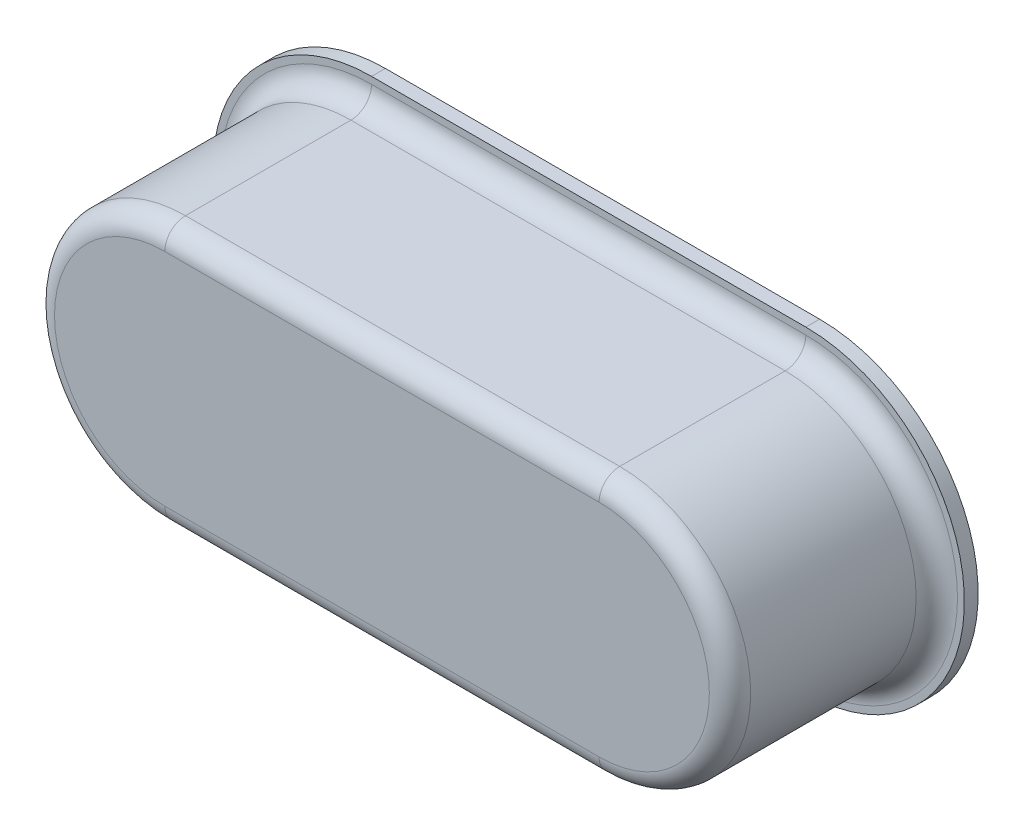
ISO-10303-21;
HEADER;
FILE_DESCRIPTION(('STEP AP214'),'2;1');
FILE_NAME('part.step','',(''),(''),'','','');
FILE_SCHEMA(('AUTOMOTIVE_DESIGN { 1 0 10303 214 1 1 1 1 }'));
ENDSEC;
DATA;
#1=APPLICATION_CONTEXT('core data for automotive mechanical design processes');
#2=APPLICATION_PROTOCOL_DEFINITION('international standard','automotive_design',2000,#1);
#3=PRODUCT_CONTEXT('',#1,'mechanical');
#4=PRODUCT('Part','Part','',(#3));
#5=PRODUCT_RELATED_PRODUCT_CATEGORY('part','',(#4));
#6=PRODUCT_DEFINITION_FORMATION('','',#4);
#7=PRODUCT_DEFINITION_CONTEXT('part definition',#1,'design');
#8=PRODUCT_DEFINITION('design','',#6,#7);
#9=PRODUCT_DEFINITION_SHAPE('','',#8);
#10=(LENGTH_UNIT() NAMED_UNIT(*) SI_UNIT(.MILLI.,.METRE.));
#11=(NAMED_UNIT(*) PLANE_ANGLE_UNIT() SI_UNIT($,.RADIAN.));
#12=(NAMED_UNIT(*) SI_UNIT($,.STERADIAN.) SOLID_ANGLE_UNIT());
#13=UNCERTAINTY_MEASURE_WITH_UNIT(LENGTH_MEASURE(1.E-05),#10,'distance_accuracy_value','');
#14=(GEOMETRIC_REPRESENTATION_CONTEXT(3) GLOBAL_UNCERTAINTY_ASSIGNED_CONTEXT((#13)) GLOBAL_UNIT_ASSIGNED_CONTEXT((#10,
#11,#12)) REPRESENTATION_CONTEXT('',''));
#15=CARTESIAN_POINT('',(0.,0.,0.));
#16=DIRECTION('',(0.,0.,1.));
#17=DIRECTION('',(1.,0.,0.));
#18=AXIS2_PLACEMENT_3D('',#15,#16,#17);
#19=CARTESIAN_POINT('',(-3.15,0.,4.));
#20=DIRECTION('',(0.,0.,1.));
#21=DIRECTION('',(1.,0.,0.));
#22=AXIS2_PLACEMENT_3D('',#19,#20,#21);
#23=PLANE('',#22);
#24=DIRECTION('',(1.,0.,0.));
#25=VECTOR('',#24,1.);
#26=CARTESIAN_POINT('',(-3.15,1.6,4.));
#27=LINE('',#26,#25);
#28=CARTESIAN_POINT('',(-3.15,1.6,4.));
#29=VERTEX_POINT('',#28);
#30=CARTESIAN_POINT('',(3.15,1.6,4.));
#31=VERTEX_POINT('',#30);
#32=EDGE_CURVE('E130',#29,#31,#27,.T.);
#33=ORIENTED_EDGE('',*,*,#32,.F.);
#34=CARTESIAN_POINT('',(-3.15,0.,4.));
#35=DIRECTION('',(0.,0.,-1.));
#36=DIRECTION('',(0.,-1.,0.));
#37=AXIS2_PLACEMENT_3D('',#34,#35,#36);
#38=CIRCLE('',#37,1.6);
#39=CARTESIAN_POINT('',(-3.15,-1.6,4.));
#40=VERTEX_POINT('',#39);
#41=EDGE_CURVE('E124',#40,#29,#38,.T.);
#42=ORIENTED_EDGE('',*,*,#41,.F.);
#43=DIRECTION('',(-1.,0.,0.));
#44=VECTOR('',#43,1.);
#45=CARTESIAN_POINT('',(-3.15,-1.6,4.));
#46=LINE('',#45,#44);
#47=CARTESIAN_POINT('',(3.15,-1.6,4.));
#48=VERTEX_POINT('',#47);
#49=EDGE_CURVE('E128',#48,#40,#46,.T.);
#50=ORIENTED_EDGE('',*,*,#49,.F.);
#51=CARTESIAN_POINT('',(3.15,0.,4.));
#52=DIRECTION('',(0.,0.,-1.));
#53=DIRECTION('',(1.,0.,0.));
#54=AXIS2_PLACEMENT_3D('',#51,#52,#53);
#55=CIRCLE('',#54,1.6);
#56=CARTESIAN_POINT('',(4.75,0.,4.));
#57=VERTEX_POINT('',#56);
#58=EDGE_CURVE('E155',#57,#48,#55,.T.);
#59=ORIENTED_EDGE('',*,*,#58,.F.);
#60=CARTESIAN_POINT('',(3.15,0.,4.));
#61=DIRECTION('',(0.,0.,-1.));
#62=DIRECTION('',(0.,1.,0.));
#63=AXIS2_PLACEMENT_3D('',#60,#61,#62);
#64=CIRCLE('',#63,1.6);
#65=EDGE_CURVE('E163',#31,#57,#64,.T.);
#66=ORIENTED_EDGE('',*,*,#65,.F.);
#67=EDGE_LOOP('',(#33,#42,#50,#59,#66));
#68=FACE_BOUND('',#67,.T.);
#69=ADVANCED_FACE('F17',(#68),#23,.T.);
#70=CARTESIAN_POINT('',(-3.15,0.,3.7));
#71=DIRECTION('',(0.,0.,1.));
#72=DIRECTION('',(1.,0.,0.));
#73=AXIS2_PLACEMENT_3D('',#70,#71,#72);
#74=TOROIDAL_SURFACE('',#73,1.6,0.3);
#75=CARTESIAN_POINT('',(-3.15,-1.6,3.7));
#76=DIRECTION('',(-1.,0.,0.));
#77=DIRECTION('',(0.,0.,1.));
#78=AXIS2_PLACEMENT_3D('',#75,#76,#77);
#79=CIRCLE('',#78,0.3);
#80=CARTESIAN_POINT('',(-3.15,-1.9,3.7));
#81=VERTEX_POINT('',#80);
#82=EDGE_CURVE('E144',#40,#81,#79,.F.);
#83=ORIENTED_EDGE('',*,*,#82,.F.);
#84=ORIENTED_EDGE('',*,*,#41,.T.);
#85=CARTESIAN_POINT('',(-3.15,1.6,3.7));
#86=DIRECTION('',(1.,0.,0.));
#87=DIRECTION('',(0.,0.,-1.));
#88=AXIS2_PLACEMENT_3D('',#85,#86,#87);
#89=CIRCLE('',#88,0.3);
#90=CARTESIAN_POINT('',(-3.15,1.9,3.7));
#91=VERTEX_POINT('',#90);
#92=EDGE_CURVE('E137',#91,#29,#89,.T.);
#93=ORIENTED_EDGE('',*,*,#92,.F.);
#94=CARTESIAN_POINT('',(-3.15,0.,3.7));
#95=DIRECTION('',(0.,0.,-1.));
#96=DIRECTION('',(-1.,0.,0.));
#97=AXIS2_PLACEMENT_3D('',#94,#95,#96);
#98=CIRCLE('',#97,1.9);
#99=EDGE_CURVE('E149',#81,#91,#98,.T.);
#100=ORIENTED_EDGE('',*,*,#99,.F.);
#101=EDGE_LOOP('',(#83,#84,#93,#100));
#102=FACE_BOUND('',#101,.T.);
#103=ADVANCED_FACE('F152',(#102),#74,.T.);
#104=CARTESIAN_POINT('',(-3.15,1.6,3.7));
#105=DIRECTION('',(1.,0.,0.));
#106=DIRECTION('',(0.,0.,-1.));
#107=AXIS2_PLACEMENT_3D('',#104,#105,#106);
#108=CYLINDRICAL_SURFACE('',#107,0.3);
#109=CARTESIAN_POINT('',(3.15,1.6,3.7));
#110=DIRECTION('',(-1.,0.,0.));
#111=DIRECTION('',(0.,1.,0.));
#112=AXIS2_PLACEMENT_3D('',#109,#110,#111);
#113=CIRCLE('',#112,0.3);
#114=CARTESIAN_POINT('',(3.15,1.9,3.7));
#115=VERTEX_POINT('',#114);
#116=EDGE_CURVE('E174',#115,#31,#113,.F.);
#117=ORIENTED_EDGE('',*,*,#116,.F.);
#118=DIRECTION('',(1.,0.,0.));
#119=VECTOR('',#118,1.);
#120=CARTESIAN_POINT('',(-3.15,1.9,3.7));
#121=LINE('',#120,#119);
#122=EDGE_CURVE('E243',#115,#91,#121,.F.);
#123=ORIENTED_EDGE('',*,*,#122,.T.);
#124=ORIENTED_EDGE('',*,*,#92,.T.);
#125=ORIENTED_EDGE('',*,*,#32,.T.);
#126=EDGE_LOOP('',(#117,#123,#124,#125));
#127=FACE_BOUND('',#126,.T.);
#128=ADVANCED_FACE('F181',(#127),#108,.T.);
#129=CARTESIAN_POINT('',(3.15,0.,3.7));
#130=DIRECTION('',(0.,0.,1.));
#131=DIRECTION('',(1.,0.,0.));
#132=AXIS2_PLACEMENT_3D('',#129,#130,#131);
#133=TOROIDAL_SURFACE('',#132,1.6,0.3);
#134=ORIENTED_EDGE('',*,*,#58,.T.);
#135=CARTESIAN_POINT('',(3.15,-1.6,3.7));
#136=DIRECTION('',(-1.,0.,0.));
#137=DIRECTION('',(0.,0.,1.));
#138=AXIS2_PLACEMENT_3D('',#135,#136,#137);
#139=CIRCLE('',#138,0.3);
#140=CARTESIAN_POINT('',(3.15,-1.9,3.7));
#141=VERTEX_POINT('',#140);
#142=EDGE_CURVE('E147',#141,#48,#139,.T.);
#143=ORIENTED_EDGE('',*,*,#142,.F.);
#144=CARTESIAN_POINT('',(3.15,0.,3.7));
#145=DIRECTION('',(0.,0.,-1.));
#146=DIRECTION('',(-1.,0.,0.));
#147=AXIS2_PLACEMENT_3D('',#144,#145,#146);
#148=CIRCLE('',#147,1.9);
#149=EDGE_CURVE('E239',#115,#141,#148,.T.);
#150=ORIENTED_EDGE('',*,*,#149,.F.);
#151=ORIENTED_EDGE('',*,*,#116,.T.);
#152=ORIENTED_EDGE('',*,*,#65,.T.);
#153=EDGE_LOOP('',(#134,#143,#150,#151,#152));
#154=FACE_BOUND('',#153,.T.);
#155=ADVANCED_FACE('F176',(#154),#133,.T.);
#156=CARTESIAN_POINT('',(-3.15,-1.6,3.7));
#157=DIRECTION('',(-1.,0.,0.));
#158=DIRECTION('',(0.,0.,1.));
#159=AXIS2_PLACEMENT_3D('',#156,#157,#158);
#160=CYLINDRICAL_SURFACE('',#159,0.3);
#161=ORIENTED_EDGE('',*,*,#142,.T.);
#162=ORIENTED_EDGE('',*,*,#49,.T.);
#163=ORIENTED_EDGE('',*,*,#82,.T.);
#164=DIRECTION('',(1.,0.,0.));
#165=VECTOR('',#164,1.);
#166=CARTESIAN_POINT('',(-3.15,-1.9,3.7));
#167=LINE('',#166,#165);
#168=EDGE_CURVE('E267',#81,#141,#167,.T.);
#169=ORIENTED_EDGE('',*,*,#168,.T.);
#170=EDGE_LOOP('',(#161,#162,#163,#169));
#171=FACE_BOUND('',#170,.T.);
#172=ADVANCED_FACE('F142',(#171),#160,.T.);
#173=CARTESIAN_POINT('',(-3.15,0.,4.));
#174=DIRECTION('',(0.,0.,-1.));
#175=DIRECTION('',(-1.,0.,0.));
#176=AXIS2_PLACEMENT_3D('',#173,#174,#175);
#177=CYLINDRICAL_SURFACE('',#176,1.9);
#178=CARTESIAN_POINT('',(-3.15,0.,1.3));
#179=DIRECTION('',(0.,0.,1.));
#180=DIRECTION('',(1.,0.,0.));
#181=AXIS2_PLACEMENT_3D('',#178,#179,#180);
#182=CIRCLE('',#181,1.9);
#183=CARTESIAN_POINT('',(-3.15,1.9,1.3));
#184=VERTEX_POINT('',#183);
#185=CARTESIAN_POINT('',(-3.15,-1.9,1.3));
#186=VERTEX_POINT('',#185);
#187=EDGE_CURVE('E293',#184,#186,#182,.T.);
#188=ORIENTED_EDGE('',*,*,#187,.T.);
#189=DIRECTION('',(0.,0.,1.));
#190=VECTOR('',#189,1.);
#191=CARTESIAN_POINT('',(-3.15,-1.9,4.));
#192=LINE('',#191,#190);
#193=EDGE_CURVE('E303',#186,#81,#192,.T.);
#194=ORIENTED_EDGE('',*,*,#193,.T.);
#195=ORIENTED_EDGE('',*,*,#99,.T.);
#196=DIRECTION('',(0.,0.,-1.));
#197=VECTOR('',#196,1.);
#198=CARTESIAN_POINT('',(-3.15,1.9,4.));
#199=LINE('',#198,#197);
#200=EDGE_CURVE('E251',#91,#184,#199,.T.);
#201=ORIENTED_EDGE('',*,*,#200,.T.);
#202=EDGE_LOOP('',(#188,#194,#195,#201));
#203=FACE_BOUND('',#202,.T.);
#204=ADVANCED_FACE('F342',(#203),#177,.T.);
#205=CARTESIAN_POINT('',(-3.15,1.9,4.));
#206=DIRECTION('',(0.,-1.,0.));
#207=DIRECTION('',(0.,0.,-1.));
#208=AXIS2_PLACEMENT_3D('',#205,#206,#207);
#209=PLANE('',#208);
#210=DIRECTION('',(-1.,0.,0.));
#211=VECTOR('',#210,1.);
#212=CARTESIAN_POINT('',(-3.15,1.9,1.3));
#213=LINE('',#212,#211);
#214=CARTESIAN_POINT('',(3.15,1.9,1.3));
#215=VERTEX_POINT('',#214);
#216=EDGE_CURVE('E288',#215,#184,#213,.T.);
#217=ORIENTED_EDGE('',*,*,#216,.T.);
#218=ORIENTED_EDGE('',*,*,#200,.F.);
#219=ORIENTED_EDGE('',*,*,#122,.F.);
#220=DIRECTION('',(0.,0.,-1.));
#221=VECTOR('',#220,1.);
#222=CARTESIAN_POINT('',(3.15,1.9,4.));
#223=LINE('',#222,#221);
#224=EDGE_CURVE('E256',#215,#115,#223,.F.);
#225=ORIENTED_EDGE('',*,*,#224,.F.);
#226=EDGE_LOOP('',(#217,#218,#219,#225));
#227=FACE_BOUND('',#226,.T.);
#228=ADVANCED_FACE('F344',(#227),#209,.F.);
#229=CARTESIAN_POINT('',(3.15,0.,4.));
#230=DIRECTION('',(0.,0.,-1.));
#231=DIRECTION('',(-1.,0.,0.));
#232=AXIS2_PLACEMENT_3D('',#229,#230,#231);
#233=CYLINDRICAL_SURFACE('',#232,1.9);
#234=ORIENTED_EDGE('',*,*,#224,.T.);
#235=ORIENTED_EDGE('',*,*,#149,.T.);
#236=DIRECTION('',(0.,0.,1.));
#237=VECTOR('',#236,1.);
#238=CARTESIAN_POINT('',(3.15,-1.9,4.));
#239=LINE('',#238,#237);
#240=CARTESIAN_POINT('',(3.15,-1.9,1.3));
#241=VERTEX_POINT('',#240);
#242=EDGE_CURVE('E270',#141,#241,#239,.F.);
#243=ORIENTED_EDGE('',*,*,#242,.T.);
#244=CARTESIAN_POINT('',(3.15,0.,1.3));
#245=DIRECTION('',(0.,0.,1.));
#246=DIRECTION('',(1.,0.,0.));
#247=AXIS2_PLACEMENT_3D('',#244,#245,#246);
#248=CIRCLE('',#247,1.9);
#249=EDGE_CURVE('E320',#241,#215,#248,.T.);
#250=ORIENTED_EDGE('',*,*,#249,.T.);
#251=EDGE_LOOP('',(#234,#235,#243,#250));
#252=FACE_BOUND('',#251,.T.);
#253=ADVANCED_FACE('F329',(#252),#233,.T.);
#254=CARTESIAN_POINT('',(-3.15,-1.9,4.));
#255=DIRECTION('',(0.,1.,0.));
#256=DIRECTION('',(0.,0.,1.));
#257=AXIS2_PLACEMENT_3D('',#254,#255,#256);
#258=PLANE('',#257);
#259=DIRECTION('',(1.,0.,0.));
#260=VECTOR('',#259,1.);
#261=CARTESIAN_POINT('',(-3.15,-1.9,1.3));
#262=LINE('',#261,#260);
#263=EDGE_CURVE('E316',#186,#241,#262,.T.);
#264=ORIENTED_EDGE('',*,*,#263,.T.);
#265=ORIENTED_EDGE('',*,*,#242,.F.);
#266=ORIENTED_EDGE('',*,*,#168,.F.);
#267=ORIENTED_EDGE('',*,*,#193,.F.);
#268=EDGE_LOOP('',(#264,#265,#266,#267));
#269=FACE_BOUND('',#268,.T.);
#270=ADVANCED_FACE('F341',(#269),#258,.F.);
#271=CARTESIAN_POINT('',(-3.15,0.,1.3));
#272=DIRECTION('',(0.,0.,1.));
#273=DIRECTION('',(1.,0.,0.));
#274=AXIS2_PLACEMENT_3D('',#271,#272,#273);
#275=TOROIDAL_SURFACE('',#274,2.2,0.3);
#276=ORIENTED_EDGE('',*,*,#187,.F.);
#277=CARTESIAN_POINT('',(-3.15,2.2,1.3));
#278=DIRECTION('',(-1.,0.,0.));
#279=DIRECTION('',(0.,0.,1.));
#280=AXIS2_PLACEMENT_3D('',#277,#278,#279);
#281=CIRCLE('',#280,0.3);
#282=CARTESIAN_POINT('',(-3.15,2.2,1.));
#283=VERTEX_POINT('',#282);
#284=EDGE_CURVE('E292',#184,#283,#281,.F.);
#285=ORIENTED_EDGE('',*,*,#284,.T.);
#286=CARTESIAN_POINT('',(-3.15,0.,1.));
#287=DIRECTION('',(0.,0.,1.));
#288=DIRECTION('',(0.,1.,0.));
#289=AXIS2_PLACEMENT_3D('',#286,#287,#288);
#290=CIRCLE('',#289,2.2);
#291=CARTESIAN_POINT('',(-3.15,-2.2,1.));
#292=VERTEX_POINT('',#291);
#293=EDGE_CURVE('E410',#292,#283,#290,.F.);
#294=ORIENTED_EDGE('',*,*,#293,.F.);
#295=CARTESIAN_POINT('',(-3.15,-2.2,1.3));
#296=DIRECTION('',(1.,0.,0.));
#297=DIRECTION('',(0.,0.,-1.));
#298=AXIS2_PLACEMENT_3D('',#295,#296,#297);
#299=CIRCLE('',#298,0.3);
#300=EDGE_CURVE('E339',#292,#186,#299,.T.);
#301=ORIENTED_EDGE('',*,*,#300,.T.);
#302=EDGE_LOOP('',(#276,#285,#294,#301));
#303=FACE_BOUND('',#302,.T.);
#304=ADVANCED_FACE('F473',(#303),#275,.F.);
#305=CARTESIAN_POINT('',(-3.15,2.2,1.3));
#306=DIRECTION('',(-1.,0.,0.));
#307=DIRECTION('',(0.,0.,1.));
#308=AXIS2_PLACEMENT_3D('',#305,#306,#307);
#309=CYLINDRICAL_SURFACE('',#308,0.3);
#310=DIRECTION('',(1.,0.,0.));
#311=VECTOR('',#310,1.);
#312=CARTESIAN_POINT('',(-3.15,2.2,1.));
#313=LINE('',#312,#311);
#314=CARTESIAN_POINT('',(3.15,2.2,1.));
#315=VERTEX_POINT('',#314);
#316=EDGE_CURVE('E407',#283,#315,#313,.T.);
#317=ORIENTED_EDGE('',*,*,#316,.F.);
#318=ORIENTED_EDGE('',*,*,#284,.F.);
#319=ORIENTED_EDGE('',*,*,#216,.F.);
#320=CARTESIAN_POINT('',(3.15,2.2,1.3));
#321=DIRECTION('',(-1.,0.,0.));
#322=DIRECTION('',(0.,1.,0.));
#323=AXIS2_PLACEMENT_3D('',#320,#321,#322);
#324=CIRCLE('',#323,0.3);
#325=EDGE_CURVE('E299',#215,#315,#324,.F.);
#326=ORIENTED_EDGE('',*,*,#325,.T.);
#327=EDGE_LOOP('',(#317,#318,#319,#326));
#328=FACE_BOUND('',#327,.T.);
#329=ADVANCED_FACE('F431',(#328),#309,.F.);
#330=CARTESIAN_POINT('',(3.15,0.,1.3));
#331=DIRECTION('',(0.,0.,1.));
#332=DIRECTION('',(1.,0.,0.));
#333=AXIS2_PLACEMENT_3D('',#330,#331,#332);
#334=TOROIDAL_SURFACE('',#333,2.2,0.3);
#335=ORIENTED_EDGE('',*,*,#249,.F.);
#336=CARTESIAN_POINT('',(3.15,-2.2,1.3));
#337=DIRECTION('',(1.,0.,0.));
#338=DIRECTION('',(0.,0.,-1.));
#339=AXIS2_PLACEMENT_3D('',#336,#337,#338);
#340=CIRCLE('',#339,0.3);
#341=CARTESIAN_POINT('',(3.15,-2.2,1.));
#342=VERTEX_POINT('',#341);
#343=EDGE_CURVE('E319',#241,#342,#340,.F.);
#344=ORIENTED_EDGE('',*,*,#343,.T.);
#345=CARTESIAN_POINT('',(3.15,0.,1.));
#346=DIRECTION('',(0.,0.,1.));
#347=DIRECTION('',(0.,-1.,0.));
#348=AXIS2_PLACEMENT_3D('',#345,#346,#347);
#349=CIRCLE('',#348,2.2);
#350=CARTESIAN_POINT('',(5.35,0.,1.));
#351=VERTEX_POINT('',#350);
#352=EDGE_CURVE('E71',#351,#342,#349,.F.);
#353=ORIENTED_EDGE('',*,*,#352,.F.);
#354=CARTESIAN_POINT('',(3.15,0.,1.));
#355=DIRECTION('',(0.,0.,1.));
#356=DIRECTION('',(1.,0.,0.));
#357=AXIS2_PLACEMENT_3D('',#354,#355,#356);
#358=CIRCLE('',#357,2.2);
#359=EDGE_CURVE('E409',#315,#351,#358,.F.);
#360=ORIENTED_EDGE('',*,*,#359,.F.);
#361=ORIENTED_EDGE('',*,*,#325,.F.);
#362=EDGE_LOOP('',(#335,#344,#353,#360,#361));
#363=FACE_BOUND('',#362,.T.);
#364=ADVANCED_FACE('F427',(#363),#334,.F.);
#365=CARTESIAN_POINT('',(-3.15,-2.2,1.3));
#366=DIRECTION('',(1.,0.,0.));
#367=DIRECTION('',(0.,0.,-1.));
#368=AXIS2_PLACEMENT_3D('',#365,#366,#367);
#369=CYLINDRICAL_SURFACE('',#368,0.3);
#370=DIRECTION('',(1.,0.,0.));
#371=VECTOR('',#370,1.);
#372=CARTESIAN_POINT('',(-3.15,-2.2,1.));
#373=LINE('',#372,#371);
#374=EDGE_CURVE('E336',#342,#292,#373,.F.);
#375=ORIENTED_EDGE('',*,*,#374,.F.);
#376=ORIENTED_EDGE('',*,*,#343,.F.);
#377=ORIENTED_EDGE('',*,*,#263,.F.);
#378=ORIENTED_EDGE('',*,*,#300,.F.);
#379=EDGE_LOOP('',(#375,#376,#377,#378));
#380=FACE_BOUND('',#379,.T.);
#381=ADVANCED_FACE('F334',(#380),#369,.F.);
#382=CARTESIAN_POINT('',(-3.15,0.,1.));
#383=DIRECTION('',(0.,0.,1.));
#384=DIRECTION('',(1.,0.,0.));
#385=AXIS2_PLACEMENT_3D('',#382,#383,#384);
#386=PLANE('',#385);
#387=CARTESIAN_POINT('',(3.15,0.,1.));
#388=DIRECTION('',(0.,0.,-1.));
#389=DIRECTION('',(-1.,0.,0.));
#390=AXIS2_PLACEMENT_3D('',#387,#388,#389);
#391=CIRCLE('',#390,2.3);
#392=CARTESIAN_POINT('',(3.15,2.3,1.));
#393=VERTEX_POINT('',#392);
#394=CARTESIAN_POINT('',(3.15,-2.3,1.));
#395=VERTEX_POINT('',#394);
#396=EDGE_CURVE('E415',#393,#395,#391,.T.);
#397=ORIENTED_EDGE('',*,*,#396,.F.);
#398=DIRECTION('',(1.,0.,0.));
#399=VECTOR('',#398,1.);
#400=CARTESIAN_POINT('',(-3.15,2.3,1.));
#401=LINE('',#400,#399);
#402=CARTESIAN_POINT('',(-3.15,2.3,1.));
#403=VERTEX_POINT('',#402);
#404=EDGE_CURVE('E459',#393,#403,#401,.F.);
#405=ORIENTED_EDGE('',*,*,#404,.T.);
#406=CARTESIAN_POINT('',(-3.15,0.,1.));
#407=DIRECTION('',(0.,0.,-1.));
#408=DIRECTION('',(-1.,0.,0.));
#409=AXIS2_PLACEMENT_3D('',#406,#407,#408);
#410=CIRCLE('',#409,2.3);
#411=CARTESIAN_POINT('',(-3.15,-2.3,1.));
#412=VERTEX_POINT('',#411);
#413=EDGE_CURVE('E62',#412,#403,#410,.T.);
#414=ORIENTED_EDGE('',*,*,#413,.F.);
#415=DIRECTION('',(1.,0.,0.));
#416=VECTOR('',#415,1.);
#417=CARTESIAN_POINT('',(-3.15,-2.3,1.));
#418=LINE('',#417,#416);
#419=EDGE_CURVE('E413',#412,#395,#418,.T.);
#420=ORIENTED_EDGE('',*,*,#419,.T.);
#421=EDGE_LOOP('',(#397,#405,#414,#420));
#422=FACE_BOUND('',#421,.T.);
#423=ORIENTED_EDGE('',*,*,#352,.T.);
#424=ORIENTED_EDGE('',*,*,#374,.T.);
#425=ORIENTED_EDGE('',*,*,#293,.T.);
#426=ORIENTED_EDGE('',*,*,#316,.T.);
#427=ORIENTED_EDGE('',*,*,#359,.T.);
#428=EDGE_LOOP('',(#423,#424,#425,#426,#427));
#429=FACE_BOUND('',#428,.T.);
#430=ADVANCED_FACE('F373',(#422,#429),#386,.T.);
#431=CARTESIAN_POINT('',(-3.15,0.,1.));
#432=DIRECTION('',(0.,0.,-1.));
#433=DIRECTION('',(-1.,0.,0.));
#434=AXIS2_PLACEMENT_3D('',#431,#432,#433);
#435=CYLINDRICAL_SURFACE('',#434,2.3);
#436=CARTESIAN_POINT('',(-3.15,0.,0.8));
#437=DIRECTION('',(0.,0.,-1.));
#438=DIRECTION('',(-1.,0.,0.));
#439=AXIS2_PLACEMENT_3D('',#436,#437,#438);
#440=CIRCLE('',#439,2.3);
#441=CARTESIAN_POINT('',(-3.15,2.3,0.8));
#442=VERTEX_POINT('',#441);
#443=CARTESIAN_POINT('',(-3.15,-2.3,0.8));
#444=VERTEX_POINT('',#443);
#445=EDGE_CURVE('E450',#442,#444,#440,.F.);
#446=ORIENTED_EDGE('',*,*,#445,.T.);
#447=DIRECTION('',(0.,0.,1.));
#448=VECTOR('',#447,1.);
#449=CARTESIAN_POINT('',(-3.15,-2.3,1.));
#450=LINE('',#449,#448);
#451=EDGE_CURVE('E416',#444,#412,#450,.T.);
#452=ORIENTED_EDGE('',*,*,#451,.T.);
#453=ORIENTED_EDGE('',*,*,#413,.T.);
#454=DIRECTION('',(0.,0.,-1.));
#455=VECTOR('',#454,1.);
#456=CARTESIAN_POINT('',(-3.15,2.3,1.));
#457=LINE('',#456,#455);
#458=EDGE_CURVE('E452',#403,#442,#457,.T.);
#459=ORIENTED_EDGE('',*,*,#458,.T.);
#460=EDGE_LOOP('',(#446,#452,#453,#459));
#461=FACE_BOUND('',#460,.T.);
#462=ADVANCED_FACE('F369',(#461),#435,.T.);
#463=CARTESIAN_POINT('',(-3.15,-2.3,1.));
#464=DIRECTION('',(0.,1.,0.));
#465=DIRECTION('',(0.,0.,1.));
#466=AXIS2_PLACEMENT_3D('',#463,#464,#465);
#467=PLANE('',#466);
#468=DIRECTION('',(0.,0.,-1.));
#469=VECTOR('',#468,1.);
#470=CARTESIAN_POINT('',(3.15,-2.3,1.));
#471=LINE('',#470,#469);
#472=CARTESIAN_POINT('',(3.15,-2.3,0.8));
#473=VERTEX_POINT('',#472);
#474=EDGE_CURVE('E449',#395,#473,#471,.T.);
#475=ORIENTED_EDGE('',*,*,#474,.F.);
#476=ORIENTED_EDGE('',*,*,#419,.F.);
#477=ORIENTED_EDGE('',*,*,#451,.F.);
#478=DIRECTION('',(1.,0.,0.));
#479=VECTOR('',#478,1.);
#480=CARTESIAN_POINT('',(-7.02577935402385,-2.3,0.8));
#481=LINE('',#480,#479);
#482=EDGE_CURVE('E451',#444,#473,#481,.T.);
#483=ORIENTED_EDGE('',*,*,#482,.T.);
#484=EDGE_LOOP('',(#475,#476,#477,#483));
#485=FACE_BOUND('',#484,.T.);
#486=ADVANCED_FACE('F365',(#485),#467,.F.);
#487=CARTESIAN_POINT('',(3.15,0.,1.));
#488=DIRECTION('',(0.,0.,-1.));
#489=DIRECTION('',(-1.,0.,0.));
#490=AXIS2_PLACEMENT_3D('',#487,#488,#489);
#491=CYLINDRICAL_SURFACE('',#490,2.3);
#492=ORIENTED_EDGE('',*,*,#396,.T.);
#493=ORIENTED_EDGE('',*,*,#474,.T.);
#494=CARTESIAN_POINT('',(3.15,0.,0.8));
#495=DIRECTION('',(0.,0.,-1.));
#496=DIRECTION('',(-1.,0.,0.));
#497=AXIS2_PLACEMENT_3D('',#494,#495,#496);
#498=CIRCLE('',#497,2.3);
#499=CARTESIAN_POINT('',(3.15,2.3,0.8));
#500=VERTEX_POINT('',#499);
#501=EDGE_CURVE('E30',#473,#500,#498,.F.);
#502=ORIENTED_EDGE('',*,*,#501,.T.);
#503=DIRECTION('',(0.,0.,-1.));
#504=VECTOR('',#503,1.);
#505=CARTESIAN_POINT('',(3.15,2.3,1.));
#506=LINE('',#505,#504);
#507=EDGE_CURVE('E38',#500,#393,#506,.F.);
#508=ORIENTED_EDGE('',*,*,#507,.T.);
#509=EDGE_LOOP('',(#492,#493,#502,#508));
#510=FACE_BOUND('',#509,.T.);
#511=ADVANCED_FACE('F359',(#510),#491,.T.);
#512=CARTESIAN_POINT('',(-3.15,2.3,1.));
#513=DIRECTION('',(0.,-1.,0.));
#514=DIRECTION('',(0.,0.,-1.));
#515=AXIS2_PLACEMENT_3D('',#512,#513,#514);
#516=PLANE('',#515);
#517=ORIENTED_EDGE('',*,*,#458,.F.);
#518=ORIENTED_EDGE('',*,*,#404,.F.);
#519=ORIENTED_EDGE('',*,*,#507,.F.);
#520=DIRECTION('',(1.,0.,0.));
#521=VECTOR('',#520,1.);
#522=CARTESIAN_POINT('',(-7.02577935402385,2.3,0.8));
#523=LINE('',#522,#521);
#524=EDGE_CURVE('E11',#500,#442,#523,.F.);
#525=ORIENTED_EDGE('',*,*,#524,.T.);
#526=EDGE_LOOP('',(#517,#518,#519,#525));
#527=FACE_BOUND('',#526,.T.);
#528=ADVANCED_FACE('F353',(#527),#516,.F.);
#529=CARTESIAN_POINT('',(-7.02577935402385,2.4,0.8));
#530=DIRECTION('',(0.,0.,1.));
#531=DIRECTION('',(1.,0.,0.));
#532=AXIS2_PLACEMENT_3D('',#529,#530,#531);
#533=PLANE('',#532);
#534=ORIENTED_EDGE('',*,*,#501,.F.);
#535=ORIENTED_EDGE('',*,*,#482,.F.);
#536=ORIENTED_EDGE('',*,*,#445,.F.);
#537=ORIENTED_EDGE('',*,*,#524,.F.);
#538=EDGE_LOOP('',(#534,#535,#536,#537));
#539=FACE_BOUND('',#538,.T.);
#540=ADVANCED_FACE('F351',(#539),#533,.F.);
#541=CLOSED_SHELL('',(#69,#103,#128,#155,#172,#204,#228,#253,#270,#304,#329,#364,#381,#430,#462,
#486,#511,#528,#540));
#542=MANIFOLD_SOLID_BREP('B1',#541);
#543=ADVANCED_BREP_SHAPE_REPRESENTATION('',(#18,#542),#14);
#544=SHAPE_DEFINITION_REPRESENTATION(#9,#543);
ENDSEC;
END-ISO-10303-21;
